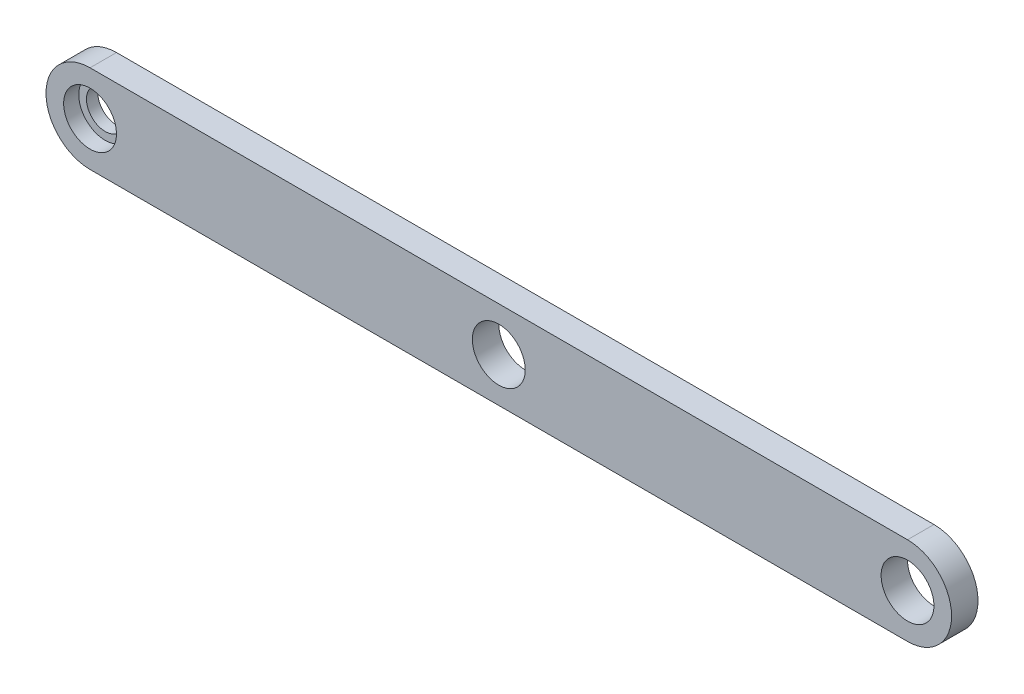
ISO-10303-21;
HEADER;
FILE_DESCRIPTION(('STEP AP214'),'2;1');
FILE_NAME('part.step','',(''),(''),'','','');
FILE_SCHEMA(('AUTOMOTIVE_DESIGN { 1 0 10303 214 1 1 1 1 }'));
ENDSEC;
DATA;
#1=APPLICATION_CONTEXT('core data for automotive mechanical design processes');
#2=APPLICATION_PROTOCOL_DEFINITION('international standard','automotive_design',2000,#1);
#3=PRODUCT_CONTEXT('',#1,'mechanical');
#4=PRODUCT('Part','Part','',(#3));
#5=PRODUCT_RELATED_PRODUCT_CATEGORY('part','',(#4));
#6=PRODUCT_DEFINITION_FORMATION('','',#4);
#7=PRODUCT_DEFINITION_CONTEXT('part definition',#1,'design');
#8=PRODUCT_DEFINITION('design','',#6,#7);
#9=PRODUCT_DEFINITION_SHAPE('','',#8);
#10=(LENGTH_UNIT() NAMED_UNIT(*) SI_UNIT(.MILLI.,.METRE.));
#11=(NAMED_UNIT(*) PLANE_ANGLE_UNIT() SI_UNIT($,.RADIAN.));
#12=(NAMED_UNIT(*) SI_UNIT($,.STERADIAN.) SOLID_ANGLE_UNIT());
#13=UNCERTAINTY_MEASURE_WITH_UNIT(LENGTH_MEASURE(1.E-05),#10,'distance_accuracy_value','');
#14=(GEOMETRIC_REPRESENTATION_CONTEXT(3) GLOBAL_UNCERTAINTY_ASSIGNED_CONTEXT((#13)) GLOBAL_UNIT_ASSIGNED_CONTEXT((#10,
#11,#12)) REPRESENTATION_CONTEXT('',''));
#15=CARTESIAN_POINT('',(0.,0.,0.));
#16=DIRECTION('',(0.,0.,1.));
#17=DIRECTION('',(1.,0.,0.));
#18=AXIS2_PLACEMENT_3D('',#15,#16,#17);
#19=CARTESIAN_POINT('',(0.,-7.93749999999998,4.7625));
#20=DIRECTION('',(0.,1.,0.));
#21=DIRECTION('',(0.,0.,1.));
#22=AXIS2_PLACEMENT_3D('',#19,#20,#21);
#23=PLANE('',#22);
#24=DIRECTION('',(1.,0.,0.));
#25=VECTOR('',#24,1.);
#26=CARTESIAN_POINT('',(0.,-7.93749999999998,0.));
#27=LINE('',#26,#25);
#28=CARTESIAN_POINT('',(-73.66,-7.93749999999998,0.));
#29=VERTEX_POINT('',#28);
#30=CARTESIAN_POINT('',(73.66,-7.93749999999998,0.));
#31=VERTEX_POINT('',#30);
#32=EDGE_CURVE('E114',#29,#31,#27,.T.);
#33=ORIENTED_EDGE('',*,*,#32,.T.);
#34=DIRECTION('',(0.,0.,-1.));
#35=VECTOR('',#34,1.);
#36=CARTESIAN_POINT('',(73.66,-7.93749999999998,4.7625));
#37=LINE('',#36,#35);
#38=CARTESIAN_POINT('',(73.66,-7.93749999999998,4.7625));
#39=VERTEX_POINT('',#38);
#40=EDGE_CURVE('E50',#39,#31,#37,.T.);
#41=ORIENTED_EDGE('',*,*,#40,.F.);
#42=DIRECTION('',(1.,0.,0.));
#43=VECTOR('',#42,1.);
#44=CARTESIAN_POINT('',(0.,-7.93749999999998,4.7625));
#45=LINE('',#44,#43);
#46=CARTESIAN_POINT('',(-73.66,-7.93749999999998,4.7625));
#47=VERTEX_POINT('',#46);
#48=EDGE_CURVE('E90',#47,#39,#45,.T.);
#49=ORIENTED_EDGE('',*,*,#48,.F.);
#50=DIRECTION('',(0.,0.,-1.));
#51=VECTOR('',#50,1.);
#52=CARTESIAN_POINT('',(-73.66,-7.93749999999998,4.7625));
#53=LINE('',#52,#51);
#54=EDGE_CURVE('E103',#47,#29,#53,.T.);
#55=ORIENTED_EDGE('',*,*,#54,.T.);
#56=EDGE_LOOP('',(#33,#41,#49,#55));
#57=FACE_BOUND('',#56,.T.);
#58=ADVANCED_FACE('F41',(#57),#23,.F.);
#59=CARTESIAN_POINT('',(73.66,0.,4.7625));
#60=DIRECTION('',(0.,0.,-1.));
#61=DIRECTION('',(-1.,0.,0.));
#62=AXIS2_PLACEMENT_3D('',#59,#60,#61);
#63=CYLINDRICAL_SURFACE('',#62,7.9375);
#64=CARTESIAN_POINT('',(73.66,0.,0.));
#65=DIRECTION('',(0.,0.,1.));
#66=DIRECTION('',(1.,0.,0.));
#67=AXIS2_PLACEMENT_3D('',#64,#65,#66);
#68=CIRCLE('',#67,7.9375);
#69=CARTESIAN_POINT('',(73.66,7.93750000000002,0.));
#70=VERTEX_POINT('',#69);
#71=EDGE_CURVE('E96',#31,#70,#68,.T.);
#72=ORIENTED_EDGE('',*,*,#71,.T.);
#73=DIRECTION('',(0.,0.,-1.));
#74=VECTOR('',#73,1.);
#75=CARTESIAN_POINT('',(73.66,7.93750000000002,4.7625));
#76=LINE('',#75,#74);
#77=CARTESIAN_POINT('',(73.66,7.93750000000002,4.7625));
#78=VERTEX_POINT('',#77);
#79=EDGE_CURVE('E94',#78,#70,#76,.T.);
#80=ORIENTED_EDGE('',*,*,#79,.F.);
#81=CARTESIAN_POINT('',(73.66,0.,4.7625));
#82=DIRECTION('',(0.,0.,1.));
#83=DIRECTION('',(1.,0.,0.));
#84=AXIS2_PLACEMENT_3D('',#81,#82,#83);
#85=CIRCLE('',#84,7.9375);
#86=EDGE_CURVE('E85',#39,#78,#85,.T.);
#87=ORIENTED_EDGE('',*,*,#86,.F.);
#88=ORIENTED_EDGE('',*,*,#40,.T.);
#89=EDGE_LOOP('',(#72,#80,#87,#88));
#90=FACE_BOUND('',#89,.T.);
#91=ADVANCED_FACE('F95',(#90),#63,.T.);
#92=CARTESIAN_POINT('',(0.,7.93750000000002,4.7625));
#93=DIRECTION('',(0.,1.,0.));
#94=DIRECTION('',(0.,0.,1.));
#95=AXIS2_PLACEMENT_3D('',#92,#93,#94);
#96=PLANE('',#95);
#97=DIRECTION('',(1.,0.,0.));
#98=VECTOR('',#97,1.);
#99=CARTESIAN_POINT('',(0.,7.93750000000002,0.));
#100=LINE('',#99,#98);
#101=CARTESIAN_POINT('',(-73.66,7.93750000000002,0.));
#102=VERTEX_POINT('',#101);
#103=EDGE_CURVE('E118',#102,#70,#100,.T.);
#104=ORIENTED_EDGE('',*,*,#103,.F.);
#105=DIRECTION('',(0.,0.,-1.));
#106=VECTOR('',#105,1.);
#107=CARTESIAN_POINT('',(-73.66,7.93750000000002,4.7625));
#108=LINE('',#107,#106);
#109=CARTESIAN_POINT('',(-73.66,7.93750000000002,4.7625));
#110=VERTEX_POINT('',#109);
#111=EDGE_CURVE('E74',#110,#102,#108,.T.);
#112=ORIENTED_EDGE('',*,*,#111,.F.);
#113=DIRECTION('',(1.,0.,0.));
#114=VECTOR('',#113,1.);
#115=CARTESIAN_POINT('',(0.,7.93750000000002,4.7625));
#116=LINE('',#115,#114);
#117=EDGE_CURVE('E88',#110,#78,#116,.T.);
#118=ORIENTED_EDGE('',*,*,#117,.T.);
#119=ORIENTED_EDGE('',*,*,#79,.T.);
#120=EDGE_LOOP('',(#104,#112,#118,#119));
#121=FACE_BOUND('',#120,.T.);
#122=ADVANCED_FACE('F101',(#121),#96,.T.);
#123=CARTESIAN_POINT('',(-73.66,0.,4.7625));
#124=DIRECTION('',(0.,0.,-1.));
#125=DIRECTION('',(-1.,0.,0.));
#126=AXIS2_PLACEMENT_3D('',#123,#124,#125);
#127=CYLINDRICAL_SURFACE('',#126,4.7625);
#128=CARTESIAN_POINT('',(-73.66,0.,2.032));
#129=DIRECTION('',(0.,0.,1.));
#130=DIRECTION('',(1.,0.,0.));
#131=AXIS2_PLACEMENT_3D('',#128,#129,#130);
#132=CIRCLE('',#131,4.7625);
#133=CARTESIAN_POINT('',(-78.4225,0.,2.032));
#134=VERTEX_POINT('',#133);
#135=EDGE_CURVE('E12',#134,#134,#132,.T.);
#136=CARTESIAN_POINT('',(-73.66,0.,4.7625));
#137=DIRECTION('',(0.,0.,1.));
#138=DIRECTION('',(1.,0.,0.));
#139=AXIS2_PLACEMENT_3D('',#136,#137,#138);
#140=CIRCLE('',#139,4.7625);
#141=CARTESIAN_POINT('',(-78.4225,0.,4.7625));
#142=VERTEX_POINT('',#141);
#143=EDGE_CURVE('E145',#142,#142,#140,.T.);
#144=CARTESIAN_POINT('',(-78.4225,0.,2.032));
#145=CARTESIAN_POINT('',(-78.4225,0.,2.06044270833333));
#146=CARTESIAN_POINT('',(-78.4225,0.,2.08888541666667));
#147=CARTESIAN_POINT('',(-78.4225,0.,2.14577083333333));
#148=CARTESIAN_POINT('',(-78.4225,0.,2.17421354166667));
#149=CARTESIAN_POINT('',(-78.4225,0.,2.23109895833333));
#150=CARTESIAN_POINT('',(-78.4225,0.,2.25954166666667));
#151=CARTESIAN_POINT('',(-78.4225,0.,2.31642708333333));
#152=CARTESIAN_POINT('',(-78.4225,0.,2.34486979166667));
#153=CARTESIAN_POINT('',(-78.4225,0.,2.40175520833333));
#154=CARTESIAN_POINT('',(-78.4225,0.,2.43019791666667));
#155=CARTESIAN_POINT('',(-78.4225,0.,2.48708333333333));
#156=CARTESIAN_POINT('',(-78.4225,0.,2.51552604166667));
#157=CARTESIAN_POINT('',(-78.4225,0.,2.57241145833333));
#158=CARTESIAN_POINT('',(-78.4225,0.,2.60085416666667));
#159=CARTESIAN_POINT('',(-78.4225,0.,2.65773958333333));
#160=CARTESIAN_POINT('',(-78.4225,0.,2.68618229166667));
#161=CARTESIAN_POINT('',(-78.4225,0.,2.74306770833333));
#162=CARTESIAN_POINT('',(-78.4225,0.,2.77151041666667));
#163=CARTESIAN_POINT('',(-78.4225,0.,2.82839583333333));
#164=CARTESIAN_POINT('',(-78.4225,0.,2.85683854166667));
#165=CARTESIAN_POINT('',(-78.4225,0.,2.91372395833333));
#166=CARTESIAN_POINT('',(-78.4225,0.,2.94216666666667));
#167=CARTESIAN_POINT('',(-78.4225,0.,2.99905208333333));
#168=CARTESIAN_POINT('',(-78.4225,0.,3.02749479166667));
#169=CARTESIAN_POINT('',(-78.4225,0.,3.08438020833333));
#170=CARTESIAN_POINT('',(-78.4225,0.,3.11282291666667));
#171=CARTESIAN_POINT('',(-78.4225,0.,3.16970833333333));
#172=CARTESIAN_POINT('',(-78.4225,0.,3.19815104166667));
#173=CARTESIAN_POINT('',(-78.4225,0.,3.25503645833333));
#174=CARTESIAN_POINT('',(-78.4225,0.,3.28347916666667));
#175=CARTESIAN_POINT('',(-78.4225,0.,3.34036458333333));
#176=CARTESIAN_POINT('',(-78.4225,0.,3.36880729166667));
#177=CARTESIAN_POINT('',(-78.4225,0.,3.42569270833333));
#178=CARTESIAN_POINT('',(-78.4225,0.,3.45413541666667));
#179=CARTESIAN_POINT('',(-78.4225,0.,3.51102083333333));
#180=CARTESIAN_POINT('',(-78.4225,0.,3.53946354166667));
#181=CARTESIAN_POINT('',(-78.4225,0.,3.59634895833333));
#182=CARTESIAN_POINT('',(-78.4225,0.,3.62479166666667));
#183=CARTESIAN_POINT('',(-78.4225,0.,3.68167708333333));
#184=CARTESIAN_POINT('',(-78.4225,0.,3.71011979166667));
#185=CARTESIAN_POINT('',(-78.4225,0.,3.76700520833333));
#186=CARTESIAN_POINT('',(-78.4225,0.,3.79544791666667));
#187=CARTESIAN_POINT('',(-78.4225,0.,3.85233333333333));
#188=CARTESIAN_POINT('',(-78.4225,0.,3.88077604166667));
#189=CARTESIAN_POINT('',(-78.4225,0.,3.93766145833333));
#190=CARTESIAN_POINT('',(-78.4225,0.,3.96610416666667));
#191=CARTESIAN_POINT('',(-78.4225,0.,4.02298958333333));
#192=CARTESIAN_POINT('',(-78.4225,0.,4.05143229166667));
#193=CARTESIAN_POINT('',(-78.4225,0.,4.10831770833333));
#194=CARTESIAN_POINT('',(-78.4225,0.,4.13676041666667));
#195=CARTESIAN_POINT('',(-78.4225,0.,4.19364583333333));
#196=CARTESIAN_POINT('',(-78.4225,0.,4.22208854166667));
#197=CARTESIAN_POINT('',(-78.4225,0.,4.27897395833333));
#198=CARTESIAN_POINT('',(-78.4225,0.,4.30741666666667));
#199=CARTESIAN_POINT('',(-78.4225,0.,4.36430208333333));
#200=CARTESIAN_POINT('',(-78.4225,0.,4.39274479166667));
#201=CARTESIAN_POINT('',(-78.4225,0.,4.44963020833333));
#202=CARTESIAN_POINT('',(-78.4225,0.,4.47807291666667));
#203=CARTESIAN_POINT('',(-78.4225,0.,4.53495833333333));
#204=CARTESIAN_POINT('',(-78.4225,0.,4.56340104166667));
#205=CARTESIAN_POINT('',(-78.4225,0.,4.62028645833333));
#206=CARTESIAN_POINT('',(-78.4225,0.,4.64872916666667));
#207=CARTESIAN_POINT('',(-78.4225,0.,4.70561458333333));
#208=CARTESIAN_POINT('',(-78.4225,0.,4.73405729166667));
#209=CARTESIAN_POINT('',(-78.4225,0.,4.7625));
#210=B_SPLINE_CURVE_WITH_KNOTS('',3,(#144,#145,#146,#147,#148,#149,#150,#151,#152,#153,#154,
#155,#156,#157,#158,#159,#160,#161,#162,#163,#164,#165,#166,#167,#168,#169,#170,#171,#172,#173,
#174,#175,#176,#177,#178,#179,#180,#181,#182,#183,#184,#185,#186,#187,#188,#189,#190,#191,#192,
#193,#194,#195,#196,#197,#198,#199,#200,#201,#202,#203,#204,#205,#206,#207,#208,#209),
.UNSPECIFIED.,.F.,.F.,(4,2,2,2,2,2,2,2,2,2,2,2,2,2,2,2,2,2,2,2,2,2,2,2,2,2,2,2,2,2,2,2,4),(0.,
0.0853281249999999,0.17065625,0.255984375,0.3413125,0.426640625,0.51196875,0.597296875,0.682625,
0.767953125,0.85328125,0.938609375,1.0239375,1.109265625,1.19459375,1.279921875,1.36525,
1.450578125,1.53590625,1.621234375,1.7065625,1.791890625,1.87721875,1.962546875,2.047875,
2.133203125,2.21853125,2.303859375,2.3891875,2.474515625,2.55984375,2.645171875,2.7305),.UNSPECIFIED.);
#211=EDGE_CURVE('BSEAM149',#134,#142,#210,.T.);
#212=ORIENTED_EDGE('',*,*,#135,.F.);
#213=ORIENTED_EDGE('',*,*,#143,.T.);
#214=ORIENTED_EDGE('',*,*,#211,.T.);
#215=ORIENTED_EDGE('',*,*,#211,.F.);
#216=EDGE_LOOP('',(#212,#214,#213,#215));
#217=FACE_BOUND('',#216,.T.);
#218=ADVANCED_FACE('F149',(#217),#127,.F.);
#219=CARTESIAN_POINT('',(73.66,0.,4.7625));
#220=DIRECTION('',(0.,0.,-1.));
#221=DIRECTION('',(-1.,0.,0.));
#222=AXIS2_PLACEMENT_3D('',#219,#220,#221);
#223=CYLINDRICAL_SURFACE('',#222,4.7625);
#224=CARTESIAN_POINT('',(73.66,0.,4.7625));
#225=DIRECTION('',(0.,0.,1.));
#226=DIRECTION('',(1.,0.,0.));
#227=AXIS2_PLACEMENT_3D('',#224,#225,#226);
#228=CIRCLE('',#227,4.7625);
#229=CARTESIAN_POINT('',(68.8975,0.,4.7625));
#230=VERTEX_POINT('',#229);
#231=EDGE_CURVE('E142',#230,#230,#228,.T.);
#232=CARTESIAN_POINT('',(73.66,0.,0.));
#233=DIRECTION('',(0.,0.,1.));
#234=DIRECTION('',(1.,0.,0.));
#235=AXIS2_PLACEMENT_3D('',#232,#233,#234);
#236=CIRCLE('',#235,4.7625);
#237=CARTESIAN_POINT('',(68.8975,0.,0.));
#238=VERTEX_POINT('',#237);
#239=EDGE_CURVE('E110',#238,#238,#236,.T.);
#240=CARTESIAN_POINT('',(68.8975,0.,4.7625));
#241=CARTESIAN_POINT('',(68.8975,0.,4.712890625));
#242=CARTESIAN_POINT('',(68.8975,0.,4.66328125));
#243=CARTESIAN_POINT('',(68.8975,0.,4.5640625));
#244=CARTESIAN_POINT('',(68.8975,0.,4.514453125));
#245=CARTESIAN_POINT('',(68.8975,0.,4.415234375));
#246=CARTESIAN_POINT('',(68.8975,0.,4.365625));
#247=CARTESIAN_POINT('',(68.8975,0.,4.26640625));
#248=CARTESIAN_POINT('',(68.8975,0.,4.216796875));
#249=CARTESIAN_POINT('',(68.8975,0.,4.117578125));
#250=CARTESIAN_POINT('',(68.8975,0.,4.06796875));
#251=CARTESIAN_POINT('',(68.8975,0.,3.96875));
#252=CARTESIAN_POINT('',(68.8975,0.,3.919140625));
#253=CARTESIAN_POINT('',(68.8975,0.,3.819921875));
#254=CARTESIAN_POINT('',(68.8975,0.,3.7703125));
#255=CARTESIAN_POINT('',(68.8975,0.,3.67109375));
#256=CARTESIAN_POINT('',(68.8975,0.,3.621484375));
#257=CARTESIAN_POINT('',(68.8975,0.,3.522265625));
#258=CARTESIAN_POINT('',(68.8975,0.,3.47265625));
#259=CARTESIAN_POINT('',(68.8975,0.,3.3734375));
#260=CARTESIAN_POINT('',(68.8975,0.,3.323828125));
#261=CARTESIAN_POINT('',(68.8975,0.,3.224609375));
#262=CARTESIAN_POINT('',(68.8975,0.,3.175));
#263=CARTESIAN_POINT('',(68.8975,0.,3.07578125));
#264=CARTESIAN_POINT('',(68.8975,0.,3.026171875));
#265=CARTESIAN_POINT('',(68.8975,0.,2.926953125));
#266=CARTESIAN_POINT('',(68.8975,0.,2.87734375));
#267=CARTESIAN_POINT('',(68.8975,0.,2.778125));
#268=CARTESIAN_POINT('',(68.8975,0.,2.728515625));
#269=CARTESIAN_POINT('',(68.8975,0.,2.629296875));
#270=CARTESIAN_POINT('',(68.8975,0.,2.5796875));
#271=CARTESIAN_POINT('',(68.8975,0.,2.48046875));
#272=CARTESIAN_POINT('',(68.8975,0.,2.430859375));
#273=CARTESIAN_POINT('',(68.8975,0.,2.331640625));
#274=CARTESIAN_POINT('',(68.8975,0.,2.28203125));
#275=CARTESIAN_POINT('',(68.8975,0.,2.1828125));
#276=CARTESIAN_POINT('',(68.8975,0.,2.133203125));
#277=CARTESIAN_POINT('',(68.8975,0.,2.033984375));
#278=CARTESIAN_POINT('',(68.8975,0.,1.984375));
#279=CARTESIAN_POINT('',(68.8975,0.,1.88515625));
#280=CARTESIAN_POINT('',(68.8975,0.,1.835546875));
#281=CARTESIAN_POINT('',(68.8975,0.,1.736328125));
#282=CARTESIAN_POINT('',(68.8975,0.,1.68671875));
#283=CARTESIAN_POINT('',(68.8975,0.,1.5875));
#284=CARTESIAN_POINT('',(68.8975,0.,1.537890625));
#285=CARTESIAN_POINT('',(68.8975,0.,1.438671875));
#286=CARTESIAN_POINT('',(68.8975,0.,1.3890625));
#287=CARTESIAN_POINT('',(68.8975,0.,1.28984375));
#288=CARTESIAN_POINT('',(68.8975,0.,1.240234375));
#289=CARTESIAN_POINT('',(68.8975,0.,1.141015625));
#290=CARTESIAN_POINT('',(68.8975,0.,1.09140625));
#291=CARTESIAN_POINT('',(68.8975,0.,0.992187499999999));
#292=CARTESIAN_POINT('',(68.8975,0.,0.942578124999999));
#293=CARTESIAN_POINT('',(68.8975,0.,0.843359375));
#294=CARTESIAN_POINT('',(68.8975,0.,0.79375));
#295=CARTESIAN_POINT('',(68.8975,0.,0.69453125));
#296=CARTESIAN_POINT('',(68.8975,0.,0.644921875));
#297=CARTESIAN_POINT('',(68.8975,0.,0.545703125));
#298=CARTESIAN_POINT('',(68.8975,0.,0.49609375));
#299=CARTESIAN_POINT('',(68.8975,0.,0.396875));
#300=CARTESIAN_POINT('',(68.8975,0.,0.347265625));
#301=CARTESIAN_POINT('',(68.8975,0.,0.248046875));
#302=CARTESIAN_POINT('',(68.8975,0.,0.1984375));
#303=CARTESIAN_POINT('',(68.8975,0.,0.09921875));
#304=CARTESIAN_POINT('',(68.8975,0.,0.049609375));
#305=CARTESIAN_POINT('',(68.8975,0.,0.));
#306=B_SPLINE_CURVE_WITH_KNOTS('',3,(#240,#241,#242,#243,#244,#245,#246,#247,#248,#249,#250,
#251,#252,#253,#254,#255,#256,#257,#258,#259,#260,#261,#262,#263,#264,#265,#266,#267,#268,#269,
#270,#271,#272,#273,#274,#275,#276,#277,#278,#279,#280,#281,#282,#283,#284,#285,#286,#287,#288,
#289,#290,#291,#292,#293,#294,#295,#296,#297,#298,#299,#300,#301,#302,#303,#304,#305),
.UNSPECIFIED.,.F.,.F.,(4,2,2,2,2,2,2,2,2,2,2,2,2,2,2,2,2,2,2,2,2,2,2,2,2,2,2,2,2,2,2,2,4),(0.,
0.148828125,0.29765625,0.446484375,0.5953125,0.744140625,0.892968750000001,1.041796875,1.190625,
1.339453125,1.48828125,1.637109375,1.7859375,1.934765625,2.08359375,2.232421875,2.38125,
2.530078125,2.67890625,2.827734375,2.9765625,3.125390625,3.27421875,3.423046875,3.571875,
3.720703125,3.86953125,4.018359375,4.1671875,4.316015625,4.46484375,4.613671875,4.7625),.UNSPECIFIED.);
#307=EDGE_CURVE('BSEAM171',#230,#238,#306,.T.);
#308=ORIENTED_EDGE('',*,*,#231,.T.);
#309=ORIENTED_EDGE('',*,*,#239,.F.);
#310=ORIENTED_EDGE('',*,*,#307,.T.);
#311=ORIENTED_EDGE('',*,*,#307,.F.);
#312=EDGE_LOOP('',(#308,#310,#309,#311));
#313=FACE_BOUND('',#312,.T.);
#314=ADVANCED_FACE('F171',(#313),#223,.F.);
#315=CARTESIAN_POINT('',(0.,0.,4.7625));
#316=DIRECTION('',(0.,0.,-1.));
#317=DIRECTION('',(-1.,0.,0.));
#318=AXIS2_PLACEMENT_3D('',#315,#316,#317);
#319=CYLINDRICAL_SURFACE('',#318,4.7625);
#320=CARTESIAN_POINT('',(0.,0.,4.7625));
#321=DIRECTION('',(0.,0.,1.));
#322=DIRECTION('',(1.,0.,0.));
#323=AXIS2_PLACEMENT_3D('',#320,#321,#322);
#324=CIRCLE('',#323,4.7625);
#325=CARTESIAN_POINT('',(-4.7625,0.,4.7625));
#326=VERTEX_POINT('',#325);
#327=EDGE_CURVE('E121',#326,#326,#324,.T.);
#328=CARTESIAN_POINT('',(0.,0.,0.));
#329=DIRECTION('',(0.,0.,1.));
#330=DIRECTION('',(1.,0.,0.));
#331=AXIS2_PLACEMENT_3D('',#328,#329,#330);
#332=CIRCLE('',#331,4.7625);
#333=CARTESIAN_POINT('',(-4.7625,0.,0.));
#334=VERTEX_POINT('',#333);
#335=EDGE_CURVE('E107',#334,#334,#332,.T.);
#336=CARTESIAN_POINT('',(-4.7625,0.,4.7625));
#337=CARTESIAN_POINT('',(-4.7625,0.,4.712890625));
#338=CARTESIAN_POINT('',(-4.7625,0.,4.66328125));
#339=CARTESIAN_POINT('',(-4.7625,0.,4.5640625));
#340=CARTESIAN_POINT('',(-4.7625,0.,4.514453125));
#341=CARTESIAN_POINT('',(-4.7625,0.,4.415234375));
#342=CARTESIAN_POINT('',(-4.7625,0.,4.365625));
#343=CARTESIAN_POINT('',(-4.7625,0.,4.26640625));
#344=CARTESIAN_POINT('',(-4.7625,0.,4.216796875));
#345=CARTESIAN_POINT('',(-4.7625,0.,4.117578125));
#346=CARTESIAN_POINT('',(-4.7625,0.,4.06796875));
#347=CARTESIAN_POINT('',(-4.7625,0.,3.96875));
#348=CARTESIAN_POINT('',(-4.7625,0.,3.919140625));
#349=CARTESIAN_POINT('',(-4.7625,0.,3.819921875));
#350=CARTESIAN_POINT('',(-4.7625,0.,3.7703125));
#351=CARTESIAN_POINT('',(-4.7625,0.,3.67109375));
#352=CARTESIAN_POINT('',(-4.7625,0.,3.621484375));
#353=CARTESIAN_POINT('',(-4.7625,0.,3.522265625));
#354=CARTESIAN_POINT('',(-4.7625,0.,3.47265625));
#355=CARTESIAN_POINT('',(-4.7625,0.,3.3734375));
#356=CARTESIAN_POINT('',(-4.7625,0.,3.323828125));
#357=CARTESIAN_POINT('',(-4.7625,0.,3.224609375));
#358=CARTESIAN_POINT('',(-4.7625,0.,3.175));
#359=CARTESIAN_POINT('',(-4.7625,0.,3.07578125));
#360=CARTESIAN_POINT('',(-4.7625,0.,3.026171875));
#361=CARTESIAN_POINT('',(-4.7625,0.,2.926953125));
#362=CARTESIAN_POINT('',(-4.7625,0.,2.87734375));
#363=CARTESIAN_POINT('',(-4.7625,0.,2.778125));
#364=CARTESIAN_POINT('',(-4.7625,0.,2.728515625));
#365=CARTESIAN_POINT('',(-4.7625,0.,2.629296875));
#366=CARTESIAN_POINT('',(-4.7625,0.,2.5796875));
#367=CARTESIAN_POINT('',(-4.7625,0.,2.48046875));
#368=CARTESIAN_POINT('',(-4.7625,0.,2.430859375));
#369=CARTESIAN_POINT('',(-4.7625,0.,2.331640625));
#370=CARTESIAN_POINT('',(-4.7625,0.,2.28203125));
#371=CARTESIAN_POINT('',(-4.7625,0.,2.1828125));
#372=CARTESIAN_POINT('',(-4.7625,0.,2.133203125));
#373=CARTESIAN_POINT('',(-4.7625,0.,2.033984375));
#374=CARTESIAN_POINT('',(-4.7625,0.,1.984375));
#375=CARTESIAN_POINT('',(-4.7625,0.,1.88515625));
#376=CARTESIAN_POINT('',(-4.7625,0.,1.835546875));
#377=CARTESIAN_POINT('',(-4.7625,0.,1.736328125));
#378=CARTESIAN_POINT('',(-4.7625,0.,1.68671875));
#379=CARTESIAN_POINT('',(-4.7625,0.,1.5875));
#380=CARTESIAN_POINT('',(-4.7625,0.,1.537890625));
#381=CARTESIAN_POINT('',(-4.7625,0.,1.438671875));
#382=CARTESIAN_POINT('',(-4.7625,0.,1.3890625));
#383=CARTESIAN_POINT('',(-4.7625,0.,1.28984375));
#384=CARTESIAN_POINT('',(-4.7625,0.,1.240234375));
#385=CARTESIAN_POINT('',(-4.7625,0.,1.141015625));
#386=CARTESIAN_POINT('',(-4.7625,0.,1.09140625));
#387=CARTESIAN_POINT('',(-4.7625,0.,0.992187499999999));
#388=CARTESIAN_POINT('',(-4.7625,0.,0.942578124999999));
#389=CARTESIAN_POINT('',(-4.7625,0.,0.843359375));
#390=CARTESIAN_POINT('',(-4.7625,0.,0.79375));
#391=CARTESIAN_POINT('',(-4.7625,0.,0.69453125));
#392=CARTESIAN_POINT('',(-4.7625,0.,0.644921875));
#393=CARTESIAN_POINT('',(-4.7625,0.,0.545703125));
#394=CARTESIAN_POINT('',(-4.7625,0.,0.49609375));
#395=CARTESIAN_POINT('',(-4.7625,0.,0.396875));
#396=CARTESIAN_POINT('',(-4.7625,0.,0.347265625));
#397=CARTESIAN_POINT('',(-4.7625,0.,0.248046875));
#398=CARTESIAN_POINT('',(-4.7625,0.,0.1984375));
#399=CARTESIAN_POINT('',(-4.7625,0.,0.09921875));
#400=CARTESIAN_POINT('',(-4.7625,0.,0.049609375));
#401=CARTESIAN_POINT('',(-4.7625,0.,0.));
#402=B_SPLINE_CURVE_WITH_KNOTS('',3,(#336,#337,#338,#339,#340,#341,#342,#343,#344,#345,#346,
#347,#348,#349,#350,#351,#352,#353,#354,#355,#356,#357,#358,#359,#360,#361,#362,#363,#364,#365,
#366,#367,#368,#369,#370,#371,#372,#373,#374,#375,#376,#377,#378,#379,#380,#381,#382,#383,#384,
#385,#386,#387,#388,#389,#390,#391,#392,#393,#394,#395,#396,#397,#398,#399,#400,#401),
.UNSPECIFIED.,.F.,.F.,(4,2,2,2,2,2,2,2,2,2,2,2,2,2,2,2,2,2,2,2,2,2,2,2,2,2,2,2,2,2,2,2,4),(0.,
0.148828125,0.29765625,0.446484375,0.5953125,0.744140625,0.892968750000001,1.041796875,1.190625,
1.339453125,1.48828125,1.637109375,1.7859375,1.934765625,2.08359375,2.232421875,2.38125,
2.530078125,2.67890625,2.827734375,2.9765625,3.125390625,3.27421875,3.423046875,3.571875,
3.720703125,3.86953125,4.018359375,4.1671875,4.316015625,4.46484375,4.613671875,4.7625),.UNSPECIFIED.);
#403=EDGE_CURVE('BSEAM43',#326,#334,#402,.T.);
#404=ORIENTED_EDGE('',*,*,#327,.T.);
#405=ORIENTED_EDGE('',*,*,#335,.F.);
#406=ORIENTED_EDGE('',*,*,#403,.T.);
#407=ORIENTED_EDGE('',*,*,#403,.F.);
#408=EDGE_LOOP('',(#404,#406,#405,#407));
#409=FACE_BOUND('',#408,.T.);
#410=ADVANCED_FACE('F43',(#409),#319,.F.);
#411=CARTESIAN_POINT('',(-73.66,0.,4.7625));
#412=DIRECTION('',(0.,0.,-1.));
#413=DIRECTION('',(-1.,0.,0.));
#414=AXIS2_PLACEMENT_3D('',#411,#412,#413);
#415=CYLINDRICAL_SURFACE('',#414,7.9375);
#416=CARTESIAN_POINT('',(-73.66,0.,0.));
#417=DIRECTION('',(0.,0.,1.));
#418=DIRECTION('',(1.,0.,0.));
#419=AXIS2_PLACEMENT_3D('',#416,#417,#418);
#420=CIRCLE('',#419,7.9375);
#421=EDGE_CURVE('E77',#102,#29,#420,.T.);
#422=ORIENTED_EDGE('',*,*,#421,.T.);
#423=ORIENTED_EDGE('',*,*,#54,.F.);
#424=CARTESIAN_POINT('',(-73.66,0.,4.7625));
#425=DIRECTION('',(0.,0.,1.));
#426=DIRECTION('',(1.,0.,0.));
#427=AXIS2_PLACEMENT_3D('',#424,#425,#426);
#428=CIRCLE('',#427,7.9375);
#429=EDGE_CURVE('E58',#110,#47,#428,.T.);
#430=ORIENTED_EDGE('',*,*,#429,.F.);
#431=ORIENTED_EDGE('',*,*,#111,.T.);
#432=EDGE_LOOP('',(#422,#423,#430,#431));
#433=FACE_BOUND('',#432,.T.);
#434=ADVANCED_FACE('F152',(#433),#415,.T.);
#435=CARTESIAN_POINT('',(0.,0.,4.7625));
#436=DIRECTION('',(0.,0.,1.));
#437=DIRECTION('',(1.,0.,0.));
#438=AXIS2_PLACEMENT_3D('',#435,#436,#437);
#439=PLANE('',#438);
#440=ORIENTED_EDGE('',*,*,#327,.F.);
#441=EDGE_LOOP('',(#440));
#442=FACE_BOUND('',#441,.T.);
#443=ORIENTED_EDGE('',*,*,#231,.F.);
#444=EDGE_LOOP('',(#443));
#445=FACE_BOUND('',#444,.T.);
#446=ORIENTED_EDGE('',*,*,#143,.F.);
#447=EDGE_LOOP('',(#446));
#448=FACE_BOUND('',#447,.T.);
#449=ORIENTED_EDGE('',*,*,#48,.T.);
#450=ORIENTED_EDGE('',*,*,#86,.T.);
#451=ORIENTED_EDGE('',*,*,#117,.F.);
#452=ORIENTED_EDGE('',*,*,#429,.T.);
#453=EDGE_LOOP('',(#449,#450,#451,#452));
#454=FACE_BOUND('',#453,.T.);
#455=ADVANCED_FACE('F86',(#442,#445,#448,#454),#439,.T.);
#456=CARTESIAN_POINT('',(0.,0.,0.));
#457=DIRECTION('',(0.,0.,1.));
#458=DIRECTION('',(1.,0.,0.));
#459=AXIS2_PLACEMENT_3D('',#456,#457,#458);
#460=PLANE('',#459);
#461=ORIENTED_EDGE('',*,*,#335,.T.);
#462=EDGE_LOOP('',(#461));
#463=FACE_BOUND('',#462,.T.);
#464=ORIENTED_EDGE('',*,*,#239,.T.);
#465=EDGE_LOOP('',(#464));
#466=FACE_BOUND('',#465,.T.);
#467=ORIENTED_EDGE('',*,*,#32,.F.);
#468=ORIENTED_EDGE('',*,*,#421,.F.);
#469=ORIENTED_EDGE('',*,*,#103,.T.);
#470=ORIENTED_EDGE('',*,*,#71,.F.);
#471=EDGE_LOOP('',(#467,#468,#469,#470));
#472=FACE_BOUND('',#471,.T.);
#473=CARTESIAN_POINT('',(-73.66,0.,0.));
#474=DIRECTION('',(0.,0.,1.));
#475=DIRECTION('',(1.,0.,0.));
#476=AXIS2_PLACEMENT_3D('',#473,#474,#475);
#477=CIRCLE('',#476,3.3734375);
#478=CARTESIAN_POINT('',(-70.2865625,0.,0.));
#479=VERTEX_POINT('',#478);
#480=EDGE_CURVE('E134',#479,#479,#477,.T.);
#481=ORIENTED_EDGE('',*,*,#480,.T.);
#482=EDGE_LOOP('',(#481));
#483=FACE_BOUND('',#482,.T.);
#484=ADVANCED_FACE('F126',(#463,#466,#472,#483),#460,.F.);
#485=CARTESIAN_POINT('',(-73.66,0.,2.032));
#486=DIRECTION('',(0.,0.,1.));
#487=DIRECTION('',(1.,0.,0.));
#488=AXIS2_PLACEMENT_3D('',#485,#486,#487);
#489=PLANE('',#488);
#490=ORIENTED_EDGE('',*,*,#135,.T.);
#491=EDGE_LOOP('',(#490));
#492=FACE_BOUND('',#491,.T.);
#493=CARTESIAN_POINT('',(-73.66,0.,2.032));
#494=DIRECTION('',(0.,0.,1.));
#495=DIRECTION('',(1.,0.,0.));
#496=AXIS2_PLACEMENT_3D('',#493,#494,#495);
#497=CIRCLE('',#496,3.3734375);
#498=CARTESIAN_POINT('',(-70.2865625,0.,2.032));
#499=VERTEX_POINT('',#498);
#500=EDGE_CURVE('E111',#499,#499,#497,.T.);
#501=ORIENTED_EDGE('',*,*,#500,.F.);
#502=EDGE_LOOP('',(#501));
#503=FACE_BOUND('',#502,.T.);
#504=ADVANCED_FACE('F129',(#492,#503),#489,.T.);
#505=CARTESIAN_POINT('',(-73.66,0.,2.032));
#506=DIRECTION('',(0.,0.,-1.));
#507=DIRECTION('',(-1.,0.,0.));
#508=AXIS2_PLACEMENT_3D('',#505,#506,#507);
#509=CYLINDRICAL_SURFACE('',#508,3.3734375);
#510=ORIENTED_EDGE('',*,*,#500,.T.);
#511=EDGE_LOOP('',(#510));
#512=FACE_BOUND('',#511,.T.);
#513=ORIENTED_EDGE('',*,*,#480,.F.);
#514=EDGE_LOOP('',(#513));
#515=FACE_BOUND('',#514,.T.);
#516=ADVANCED_FACE('F220',(#512,#515),#509,.F.);
#517=CLOSED_SHELL('',(#58,#91,#122,#218,#314,#410,#434,#455,#484,#504,#516));
#518=MANIFOLD_SOLID_BREP('B2',#517);
#519=ADVANCED_BREP_SHAPE_REPRESENTATION('',(#18,#518),#14);
#520=SHAPE_DEFINITION_REPRESENTATION(#9,#519);
ENDSEC;
END-ISO-10303-21;
